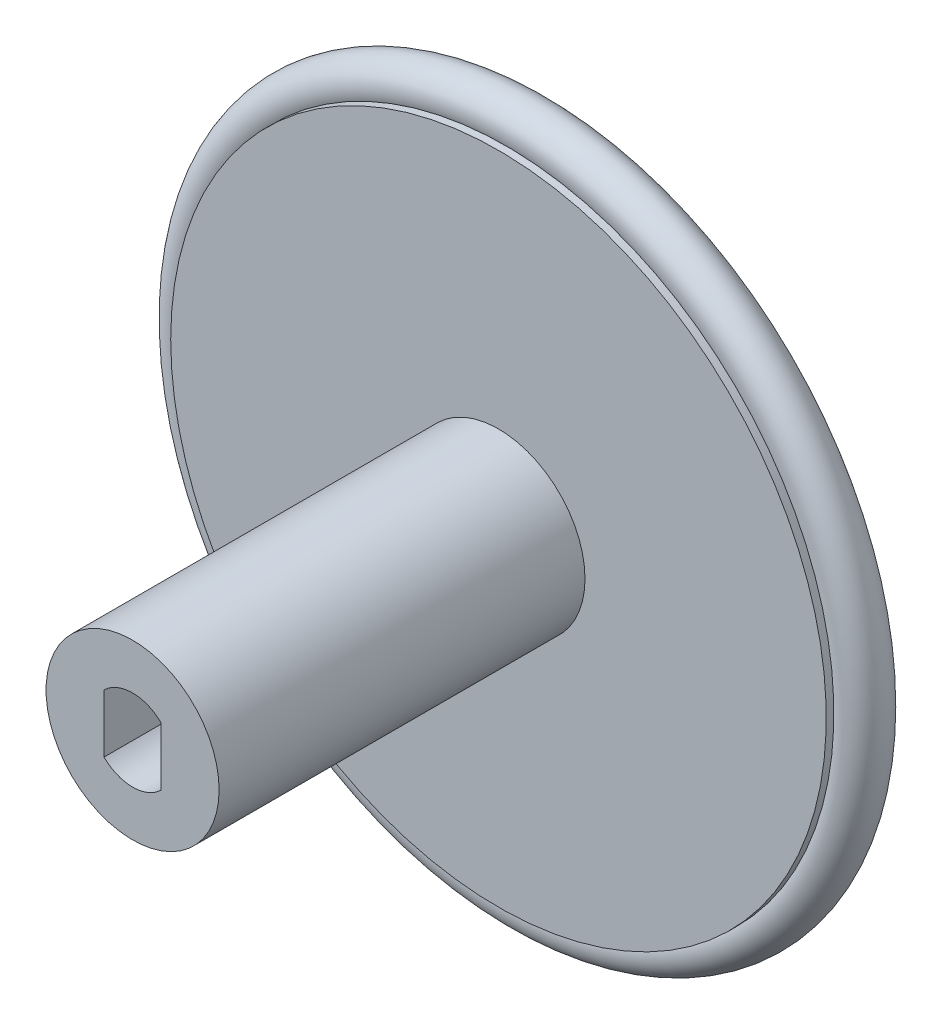
ISO-10303-21;
HEADER;
FILE_DESCRIPTION(('STEP AP214'),'2;1');
FILE_NAME('part.step','',(''),(''),'','','');
FILE_SCHEMA(('AUTOMOTIVE_DESIGN { 1 0 10303 214 1 1 1 1 }'));
ENDSEC;
DATA;
#1=APPLICATION_CONTEXT('core data for automotive mechanical design processes');
#2=APPLICATION_PROTOCOL_DEFINITION('international standard','automotive_design',2000,#1);
#3=PRODUCT_CONTEXT('',#1,'mechanical');
#4=PRODUCT('Part','Part','',(#3));
#5=PRODUCT_RELATED_PRODUCT_CATEGORY('part','',(#4));
#6=PRODUCT_DEFINITION_FORMATION('','',#4);
#7=PRODUCT_DEFINITION_CONTEXT('part definition',#1,'design');
#8=PRODUCT_DEFINITION('design','',#6,#7);
#9=PRODUCT_DEFINITION_SHAPE('','',#8);
#10=(LENGTH_UNIT() NAMED_UNIT(*) SI_UNIT(.MILLI.,.METRE.));
#11=(NAMED_UNIT(*) PLANE_ANGLE_UNIT() SI_UNIT($,.RADIAN.));
#12=(NAMED_UNIT(*) SI_UNIT($,.STERADIAN.) SOLID_ANGLE_UNIT());
#13=UNCERTAINTY_MEASURE_WITH_UNIT(LENGTH_MEASURE(1.E-05),#10,'distance_accuracy_value','');
#14=(GEOMETRIC_REPRESENTATION_CONTEXT(3) GLOBAL_UNCERTAINTY_ASSIGNED_CONTEXT((#13)) GLOBAL_UNIT_ASSIGNED_CONTEXT((#10,
#11,#12)) REPRESENTATION_CONTEXT('',''));
#15=CARTESIAN_POINT('',(0.,0.,0.));
#16=DIRECTION('',(0.,0.,1.));
#17=DIRECTION('',(1.,0.,0.));
#18=AXIS2_PLACEMENT_3D('',#15,#16,#17);
#19=CARTESIAN_POINT('',(0.,0.,0.));
#20=DIRECTION('',(0.,0.,1.));
#21=DIRECTION('',(1.,0.,0.));
#22=AXIS2_PLACEMENT_3D('',#19,#20,#21);
#23=TOROIDAL_SURFACE('',#22,22.039552593733,1.5);
#24=CARTESIAN_POINT('',(23.539552593733,0.,0.));
#25=VERTEX_POINT('',#24);
#26=VERTEX_LOOP('',#25);
#27=FACE_BOUND('',#26,.T.);
#28=ADVANCED_FACE('F44',(#27),#23,.T.);
#29=CLOSED_SHELL('',(#28));
#30=MANIFOLD_SOLID_BREP('B2_NOT_SHOWN',#29);
#31=CARTESIAN_POINT('',(0.,0.,-1.90000000000001));
#32=DIRECTION('',(0.,0.,-1.));
#33=DIRECTION('',(-1.,0.,0.));
#34=AXIS2_PLACEMENT_3D('',#31,#32,#33);
#35=PLANE('',#34);
#36=CARTESIAN_POINT('',(0.,0.,-1.90000000000001));
#37=DIRECTION('',(0.,0.,-1.));
#38=DIRECTION('',(-1.,0.,0.));
#39=AXIS2_PLACEMENT_3D('',#36,#37,#38);
#40=CIRCLE('',#39,21.5);
#41=CARTESIAN_POINT('',(-21.5,0.,-1.90000000000001));
#42=VERTEX_POINT('',#41);
#43=EDGE_CURVE('E59',#42,#42,#40,.T.);
#44=ORIENTED_EDGE('',*,*,#43,.T.);
#45=EDGE_LOOP('',(#44));
#46=FACE_BOUND('',#45,.T.);
#47=ADVANCED_FACE('F56',(#46),#35,.T.);
#48=CARTESIAN_POINT('',(0.,0.,-6.22705657946134));
#49=DIRECTION('',(0.,0.,-1.));
#50=DIRECTION('',(-1.,0.,0.));
#51=AXIS2_PLACEMENT_3D('',#48,#49,#50);
#52=CYLINDRICAL_SURFACE('',#51,21.5);
#53=CARTESIAN_POINT('',(0.,0.,-1.40000000000001));
#54=DIRECTION('',(0.,0.,-1.));
#55=DIRECTION('',(-1.,0.,0.));
#56=AXIS2_PLACEMENT_3D('',#53,#54,#55);
#57=CIRCLE('',#56,21.5);
#58=CARTESIAN_POINT('',(-21.5,0.,-1.40000000000001));
#59=VERTEX_POINT('',#58);
#60=EDGE_CURVE('E147',#59,#59,#57,.T.);
#61=ORIENTED_EDGE('',*,*,#60,.T.);
#62=EDGE_LOOP('',(#61));
#63=FACE_BOUND('',#62,.T.);
#64=ORIENTED_EDGE('',*,*,#43,.F.);
#65=EDGE_LOOP('',(#64));
#66=FACE_BOUND('',#65,.T.);
#67=ADVANCED_FACE('F155',(#63,#66),#52,.T.);
#68=CARTESIAN_POINT('',(0.,0.,-1.40000000000001));
#69=DIRECTION('',(0.,0.,-1.));
#70=DIRECTION('',(-1.,0.,0.));
#71=AXIS2_PLACEMENT_3D('',#68,#69,#70);
#72=CONICAL_SURFACE('',#71,21.5,1.22522113490003);
#73=CARTESIAN_POINT('',(0.,0.,-0.500000000000015));
#74=DIRECTION('',(0.,0.,-1.));
#75=DIRECTION('',(-1.,0.,0.));
#76=AXIS2_PLACEMENT_3D('',#73,#74,#75);
#77=CIRCLE('',#76,19.0001538314765);
#78=CARTESIAN_POINT('',(-19.0001538314765,0.,-0.500000000000015));
#79=VERTEX_POINT('',#78);
#80=EDGE_CURVE('E145',#79,#79,#77,.T.);
#81=ORIENTED_EDGE('',*,*,#80,.T.);
#82=EDGE_LOOP('',(#81));
#83=FACE_BOUND('',#82,.T.);
#84=ORIENTED_EDGE('',*,*,#60,.F.);
#85=EDGE_LOOP('',(#84));
#86=FACE_BOUND('',#85,.T.);
#87=ADVANCED_FACE('F157',(#83,#86),#72,.T.);
#88=CARTESIAN_POINT('',(0.,0.,-6.22705657946134));
#89=DIRECTION('',(0.,0.,-1.));
#90=DIRECTION('',(-1.,0.,0.));
#91=AXIS2_PLACEMENT_3D('',#88,#89,#90);
#92=CYLINDRICAL_SURFACE('',#91,19.0001538314765);
#93=CARTESIAN_POINT('',(0.,0.,0.500000000000007));
#94=DIRECTION('',(0.,0.,-1.));
#95=DIRECTION('',(-1.,0.,0.));
#96=AXIS2_PLACEMENT_3D('',#93,#94,#95);
#97=CIRCLE('',#96,19.0001538314765);
#98=CARTESIAN_POINT('',(-19.0001538314765,0.,0.500000000000007));
#99=VERTEX_POINT('',#98);
#100=EDGE_CURVE('E142',#99,#99,#97,.T.);
#101=ORIENTED_EDGE('',*,*,#100,.T.);
#102=EDGE_LOOP('',(#101));
#103=FACE_BOUND('',#102,.T.);
#104=ORIENTED_EDGE('',*,*,#80,.F.);
#105=EDGE_LOOP('',(#104));
#106=FACE_BOUND('',#105,.T.);
#107=ADVANCED_FACE('F162',(#103,#106),#92,.T.);
#108=CARTESIAN_POINT('',(0.,0.,0.500000000000007));
#109=DIRECTION('',(0.,0.,1.));
#110=DIRECTION('',(1.,0.,0.));
#111=AXIS2_PLACEMENT_3D('',#108,#109,#110);
#112=CONICAL_SURFACE('',#111,19.0001538314765,1.22522113490003);
#113=CARTESIAN_POINT('',(0.,0.,1.4));
#114=DIRECTION('',(0.,0.,-1.));
#115=DIRECTION('',(-1.,0.,0.));
#116=AXIS2_PLACEMENT_3D('',#113,#114,#115);
#117=CIRCLE('',#116,21.5);
#118=CARTESIAN_POINT('',(-21.5,0.,1.4));
#119=VERTEX_POINT('',#118);
#120=EDGE_CURVE('E139',#119,#119,#117,.T.);
#121=ORIENTED_EDGE('',*,*,#120,.T.);
#122=EDGE_LOOP('',(#121));
#123=FACE_BOUND('',#122,.T.);
#124=ORIENTED_EDGE('',*,*,#100,.F.);
#125=EDGE_LOOP('',(#124));
#126=FACE_BOUND('',#125,.T.);
#127=ADVANCED_FACE('F168',(#123,#126),#112,.T.);
#128=CARTESIAN_POINT('',(0.,0.,-6.22705657946134));
#129=DIRECTION('',(0.,0.,-1.));
#130=DIRECTION('',(-1.,0.,0.));
#131=AXIS2_PLACEMENT_3D('',#128,#129,#130);
#132=CYLINDRICAL_SURFACE('',#131,21.5);
#133=CARTESIAN_POINT('',(0.,0.,1.9));
#134=DIRECTION('',(0.,0.,-1.));
#135=DIRECTION('',(-1.,0.,0.));
#136=AXIS2_PLACEMENT_3D('',#133,#134,#135);
#137=CIRCLE('',#136,21.5);
#138=CARTESIAN_POINT('',(-21.5,0.,1.9));
#139=VERTEX_POINT('',#138);
#140=EDGE_CURVE('E135',#139,#139,#137,.T.);
#141=ORIENTED_EDGE('',*,*,#140,.T.);
#142=EDGE_LOOP('',(#141));
#143=FACE_BOUND('',#142,.T.);
#144=ORIENTED_EDGE('',*,*,#120,.F.);
#145=EDGE_LOOP('',(#144));
#146=FACE_BOUND('',#145,.T.);
#147=ADVANCED_FACE('F172',(#143,#146),#132,.T.);
#148=CARTESIAN_POINT('',(0.,0.,1.9));
#149=DIRECTION('',(0.,0.,1.));
#150=DIRECTION('',(1.,0.,0.));
#151=AXIS2_PLACEMENT_3D('',#148,#149,#150);
#152=PLANE('',#151);
#153=CARTESIAN_POINT('',(0.,0.,1.9));
#154=DIRECTION('',(0.,0.,1.));
#155=DIRECTION('',(1.,0.,0.));
#156=AXIS2_PLACEMENT_3D('',#153,#154,#155);
#157=CIRCLE('',#156,5.675);
#158=CARTESIAN_POINT('',(5.675,0.,1.9));
#159=VERTEX_POINT('',#158);
#160=EDGE_CURVE('E42',#159,#159,#157,.T.);
#161=ORIENTED_EDGE('',*,*,#160,.F.);
#162=EDGE_LOOP('',(#161));
#163=FACE_BOUND('',#162,.T.);
#164=ORIENTED_EDGE('',*,*,#140,.F.);
#165=EDGE_LOOP('',(#164));
#166=FACE_BOUND('',#165,.T.);
#167=ADVANCED_FACE('F176',(#163,#166),#152,.T.);
#168=CARTESIAN_POINT('',(0.,0.,25.9));
#169=DIRECTION('',(0.,0.,1.));
#170=DIRECTION('',(1.,0.,0.));
#171=AXIS2_PLACEMENT_3D('',#168,#169,#170);
#172=PLANE('',#171);
#173=CARTESIAN_POINT('',(0.,0.,25.9));
#174=DIRECTION('',(0.,0.,1.));
#175=DIRECTION('',(1.,0.,0.));
#176=AXIS2_PLACEMENT_3D('',#173,#174,#175);
#177=CIRCLE('',#176,5.675);
#178=CARTESIAN_POINT('',(5.675,0.,25.9));
#179=VERTEX_POINT('',#178);
#180=EDGE_CURVE('E133',#179,#179,#177,.T.);
#181=ORIENTED_EDGE('',*,*,#180,.T.);
#182=EDGE_LOOP('',(#181));
#183=FACE_BOUND('',#182,.T.);
#184=DIRECTION('',(0.,1.,0.));
#185=VECTOR('',#184,1.);
#186=CARTESIAN_POINT('',(1.875,1.90787840283389,25.9));
#187=LINE('',#186,#185);
#188=CARTESIAN_POINT('',(1.875,-1.90787840283389,25.9));
#189=VERTEX_POINT('',#188);
#190=CARTESIAN_POINT('',(1.875,1.90787840283389,25.9));
#191=VERTEX_POINT('',#190);
#192=EDGE_CURVE('E123',#189,#191,#187,.T.);
#193=ORIENTED_EDGE('',*,*,#192,.F.);
#194=CARTESIAN_POINT('',(0.,0.,25.9));
#195=DIRECTION('',(0.,0.,1.));
#196=DIRECTION('',(1.,0.,0.));
#197=AXIS2_PLACEMENT_3D('',#194,#195,#196);
#198=CIRCLE('',#197,2.67500000000001);
#199=CARTESIAN_POINT('',(-1.875,-1.90787840283389,25.9));
#200=VERTEX_POINT('',#199);
#201=EDGE_CURVE('E120',#200,#189,#198,.T.);
#202=ORIENTED_EDGE('',*,*,#201,.F.);
#203=DIRECTION('',(0.,-1.,0.));
#204=VECTOR('',#203,1.);
#205=CARTESIAN_POINT('',(-1.875,1.90787840283389,25.9));
#206=LINE('',#205,#204);
#207=CARTESIAN_POINT('',(-1.875,1.90787840283389,25.9));
#208=VERTEX_POINT('',#207);
#209=EDGE_CURVE('E105',#208,#200,#206,.T.);
#210=ORIENTED_EDGE('',*,*,#209,.F.);
#211=CARTESIAN_POINT('',(0.,0.,25.9));
#212=DIRECTION('',(0.,0.,1.));
#213=DIRECTION('',(-1.,0.,0.));
#214=AXIS2_PLACEMENT_3D('',#211,#212,#213);
#215=CIRCLE('',#214,2.675);
#216=EDGE_CURVE('E125',#191,#208,#215,.T.);
#217=ORIENTED_EDGE('',*,*,#216,.F.);
#218=EDGE_LOOP('',(#193,#202,#210,#217));
#219=FACE_BOUND('',#218,.T.);
#220=ADVANCED_FACE('F180',(#183,#219),#172,.T.);
#221=CARTESIAN_POINT('',(0.,0.,25.9));
#222=DIRECTION('',(0.,0.,-1.));
#223=DIRECTION('',(-1.,0.,0.));
#224=AXIS2_PLACEMENT_3D('',#221,#222,#223);
#225=CYLINDRICAL_SURFACE('',#224,5.675);
#226=ORIENTED_EDGE('',*,*,#180,.F.);
#227=EDGE_LOOP('',(#226));
#228=FACE_BOUND('',#227,.T.);
#229=ORIENTED_EDGE('',*,*,#160,.T.);
#230=EDGE_LOOP('',(#229));
#231=FACE_BOUND('',#230,.T.);
#232=ADVANCED_FACE('F182',(#228,#231),#225,.T.);
#233=CARTESIAN_POINT('',(0.,0.,25.9));
#234=DIRECTION('',(0.,0.,-1.));
#235=DIRECTION('',(-1.,0.,0.));
#236=AXIS2_PLACEMENT_3D('',#233,#234,#235);
#237=CYLINDRICAL_SURFACE('',#236,2.67500000000001);
#238=CARTESIAN_POINT('',(0.,0.,20.9));
#239=DIRECTION('',(0.,0.,1.));
#240=DIRECTION('',(1.,0.,0.));
#241=AXIS2_PLACEMENT_3D('',#238,#239,#240);
#242=CIRCLE('',#241,2.67500000000001);
#243=CARTESIAN_POINT('',(-1.875,-1.90787840283389,20.9));
#244=VERTEX_POINT('',#243);
#245=CARTESIAN_POINT('',(1.875,-1.90787840283389,20.9));
#246=VERTEX_POINT('',#245);
#247=EDGE_CURVE('E111',#244,#246,#242,.T.);
#248=ORIENTED_EDGE('',*,*,#247,.F.);
#249=DIRECTION('',(0.,0.,-1.));
#250=VECTOR('',#249,1.);
#251=CARTESIAN_POINT('',(-1.875,-1.90787840283389,25.9));
#252=LINE('',#251,#250);
#253=EDGE_CURVE('E99',#200,#244,#252,.T.);
#254=ORIENTED_EDGE('',*,*,#253,.F.);
#255=ORIENTED_EDGE('',*,*,#201,.T.);
#256=DIRECTION('',(0.,0.,-1.));
#257=VECTOR('',#256,1.);
#258=CARTESIAN_POINT('',(1.875,-1.90787840283389,25.9));
#259=LINE('',#258,#257);
#260=EDGE_CURVE('E113',#189,#246,#259,.T.);
#261=ORIENTED_EDGE('',*,*,#260,.T.);
#262=EDGE_LOOP('',(#248,#254,#255,#261));
#263=FACE_BOUND('',#262,.T.);
#264=ADVANCED_FACE('F112',(#263),#237,.F.);
#265=CARTESIAN_POINT('',(1.875,1.90787840283389,25.9));
#266=DIRECTION('',(-1.,0.,0.));
#267=DIRECTION('',(0.,0.,1.));
#268=AXIS2_PLACEMENT_3D('',#265,#266,#267);
#269=PLANE('',#268);
#270=DIRECTION('',(0.,1.,0.));
#271=VECTOR('',#270,1.);
#272=CARTESIAN_POINT('',(1.875,-1.90787840283389,20.9));
#273=LINE('',#272,#271);
#274=CARTESIAN_POINT('',(1.875,1.90787840283389,20.9));
#275=VERTEX_POINT('',#274);
#276=EDGE_CURVE('E71',#246,#275,#273,.T.);
#277=ORIENTED_EDGE('',*,*,#276,.F.);
#278=ORIENTED_EDGE('',*,*,#260,.F.);
#279=ORIENTED_EDGE('',*,*,#192,.T.);
#280=DIRECTION('',(0.,0.,-1.));
#281=VECTOR('',#280,1.);
#282=CARTESIAN_POINT('',(1.875,1.90787840283389,25.9));
#283=LINE('',#282,#281);
#284=EDGE_CURVE('E130',#191,#275,#283,.T.);
#285=ORIENTED_EDGE('',*,*,#284,.T.);
#286=EDGE_LOOP('',(#277,#278,#279,#285));
#287=FACE_BOUND('',#286,.T.);
#288=ADVANCED_FACE('F191',(#287),#269,.T.);
#289=CARTESIAN_POINT('',(0.,0.,25.9));
#290=DIRECTION('',(0.,0.,-1.));
#291=DIRECTION('',(-1.,0.,0.));
#292=AXIS2_PLACEMENT_3D('',#289,#290,#291);
#293=CYLINDRICAL_SURFACE('',#292,2.675);
#294=CARTESIAN_POINT('',(0.,0.,20.9));
#295=DIRECTION('',(0.,0.,1.));
#296=DIRECTION('',(1.,0.,0.));
#297=AXIS2_PLACEMENT_3D('',#294,#295,#296);
#298=CIRCLE('',#297,2.675);
#299=CARTESIAN_POINT('',(-1.875,1.90787840283389,20.9));
#300=VERTEX_POINT('',#299);
#301=EDGE_CURVE('E79',#275,#300,#298,.T.);
#302=ORIENTED_EDGE('',*,*,#301,.F.);
#303=ORIENTED_EDGE('',*,*,#284,.F.);
#304=ORIENTED_EDGE('',*,*,#216,.T.);
#305=DIRECTION('',(0.,0.,-1.));
#306=VECTOR('',#305,1.);
#307=CARTESIAN_POINT('',(-1.875,1.90787840283389,25.9));
#308=LINE('',#307,#306);
#309=EDGE_CURVE('E108',#208,#300,#308,.T.);
#310=ORIENTED_EDGE('',*,*,#309,.T.);
#311=EDGE_LOOP('',(#302,#303,#304,#310));
#312=FACE_BOUND('',#311,.T.);
#313=ADVANCED_FACE('F194',(#312),#293,.F.);
#314=CARTESIAN_POINT('',(-1.875,1.90787840283389,25.9));
#315=DIRECTION('',(1.,0.,0.));
#316=DIRECTION('',(0.,0.,-1.));
#317=AXIS2_PLACEMENT_3D('',#314,#315,#316);
#318=PLANE('',#317);
#319=DIRECTION('',(0.,-1.,0.));
#320=VECTOR('',#319,1.);
#321=CARTESIAN_POINT('',(-1.875,1.90787840283389,20.9));
#322=LINE('',#321,#320);
#323=EDGE_CURVE('E103',#300,#244,#322,.T.);
#324=ORIENTED_EDGE('',*,*,#323,.F.);
#325=ORIENTED_EDGE('',*,*,#309,.F.);
#326=ORIENTED_EDGE('',*,*,#209,.T.);
#327=ORIENTED_EDGE('',*,*,#253,.T.);
#328=EDGE_LOOP('',(#324,#325,#326,#327));
#329=FACE_BOUND('',#328,.T.);
#330=ADVANCED_FACE('F101',(#329),#318,.T.);
#331=CARTESIAN_POINT('',(0.,0.,20.9));
#332=DIRECTION('',(0.,0.,1.));
#333=DIRECTION('',(1.,0.,0.));
#334=AXIS2_PLACEMENT_3D('',#331,#332,#333);
#335=PLANE('',#334);
#336=ORIENTED_EDGE('',*,*,#301,.T.);
#337=ORIENTED_EDGE('',*,*,#323,.T.);
#338=ORIENTED_EDGE('',*,*,#247,.T.);
#339=ORIENTED_EDGE('',*,*,#276,.T.);
#340=EDGE_LOOP('',(#336,#337,#338,#339));
#341=FACE_BOUND('',#340,.T.);
#342=ADVANCED_FACE('F116',(#341),#335,.T.);
#343=CLOSED_SHELL('',(#47,#67,#87,#107,#127,#147,#167,#220,#232,#264,#288,#313,#330,#342));
#344=MANIFOLD_SOLID_BREP('B6',#343);
#345=ADVANCED_BREP_SHAPE_REPRESENTATION('',(#18,#30,#344),#14);
#346=SHAPE_DEFINITION_REPRESENTATION(#9,#345);
ENDSEC;
END-ISO-10303-21;
